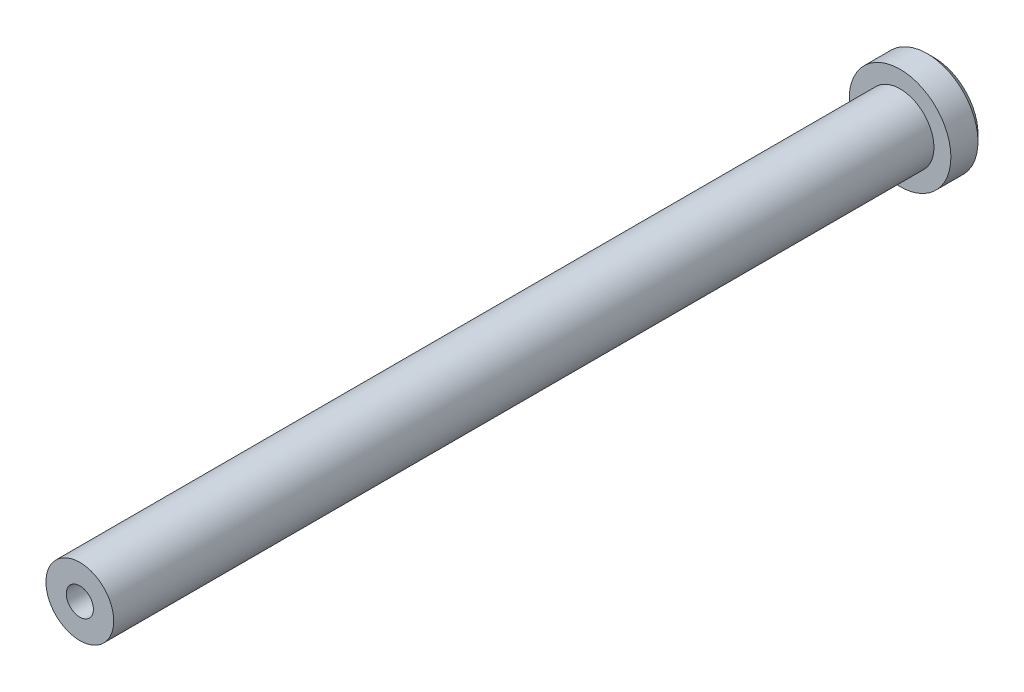
ISO-10303-21;
HEADER;
FILE_DESCRIPTION(('STEP AP214'),'2;1');
FILE_NAME('part.step','',(''),(''),'','','');
FILE_SCHEMA(('AUTOMOTIVE_DESIGN { 1 0 10303 214 1 1 1 1 }'));
ENDSEC;
DATA;
#1=APPLICATION_CONTEXT('core data for automotive mechanical design processes');
#2=APPLICATION_PROTOCOL_DEFINITION('international standard','automotive_design',2000,#1);
#3=PRODUCT_CONTEXT('',#1,'mechanical');
#4=PRODUCT('Part','Part','',(#3));
#5=PRODUCT_RELATED_PRODUCT_CATEGORY('part','',(#4));
#6=PRODUCT_DEFINITION_FORMATION('','',#4);
#7=PRODUCT_DEFINITION_CONTEXT('part definition',#1,'design');
#8=PRODUCT_DEFINITION('design','',#6,#7);
#9=PRODUCT_DEFINITION_SHAPE('','',#8);
#10=(LENGTH_UNIT() NAMED_UNIT(*) SI_UNIT(.MILLI.,.METRE.));
#11=(NAMED_UNIT(*) PLANE_ANGLE_UNIT() SI_UNIT($,.RADIAN.));
#12=(NAMED_UNIT(*) SI_UNIT($,.STERADIAN.) SOLID_ANGLE_UNIT());
#13=UNCERTAINTY_MEASURE_WITH_UNIT(LENGTH_MEASURE(1.E-05),#10,'distance_accuracy_value','');
#14=(GEOMETRIC_REPRESENTATION_CONTEXT(3) GLOBAL_UNCERTAINTY_ASSIGNED_CONTEXT((#13)) GLOBAL_UNIT_ASSIGNED_CONTEXT((#10,
#11,#12)) REPRESENTATION_CONTEXT('',''));
#15=CARTESIAN_POINT('',(0.,0.,0.));
#16=DIRECTION('',(0.,0.,1.));
#17=DIRECTION('',(1.,0.,0.));
#18=AXIS2_PLACEMENT_3D('',#15,#16,#17);
#19=CARTESIAN_POINT('',(0.,0.,5.));
#20=DIRECTION('',(0.,0.,-1.));
#21=DIRECTION('',(-1.,0.,0.));
#22=AXIS2_PLACEMENT_3D('',#19,#20,#21);
#23=CYLINDRICAL_SURFACE('',#22,7.5);
#24=CARTESIAN_POINT('',(0.,0.,0.999999999999995));
#25=DIRECTION('',(0.,0.,1.));
#26=DIRECTION('',(1.,0.,0.));
#27=AXIS2_PLACEMENT_3D('',#24,#25,#26);
#28=CIRCLE('',#27,7.5);
#29=CARTESIAN_POINT('',(7.5,0.,0.999999999999995));
#30=VERTEX_POINT('',#29);
#31=EDGE_CURVE('E47',#30,#30,#28,.T.);
#32=ORIENTED_EDGE('',*,*,#31,.T.);
#33=EDGE_LOOP('',(#32));
#34=FACE_BOUND('',#33,.T.);
#35=CARTESIAN_POINT('',(0.,0.,5.));
#36=DIRECTION('',(0.,0.,1.));
#37=DIRECTION('',(1.,0.,0.));
#38=AXIS2_PLACEMENT_3D('',#35,#36,#37);
#39=CIRCLE('',#38,7.5);
#40=CARTESIAN_POINT('',(7.5,0.,5.));
#41=VERTEX_POINT('',#40);
#42=EDGE_CURVE('E53',#41,#41,#39,.T.);
#43=ORIENTED_EDGE('',*,*,#42,.F.);
#44=EDGE_LOOP('',(#43));
#45=FACE_BOUND('',#44,.T.);
#46=ADVANCED_FACE('F39',(#34,#45),#23,.T.);
#47=CARTESIAN_POINT('',(0.,0.,5.));
#48=DIRECTION('',(0.,0.,1.));
#49=DIRECTION('',(1.,0.,0.));
#50=AXIS2_PLACEMENT_3D('',#47,#48,#49);
#51=PLANE('',#50);
#52=CARTESIAN_POINT('',(0.,0.,5.));
#53=DIRECTION('',(0.,0.,1.));
#54=DIRECTION('',(1.,0.,0.));
#55=AXIS2_PLACEMENT_3D('',#52,#53,#54);
#56=CIRCLE('',#55,5.);
#57=CARTESIAN_POINT('',(5.,0.,5.));
#58=VERTEX_POINT('',#57);
#59=EDGE_CURVE('E62',#58,#58,#56,.T.);
#60=ORIENTED_EDGE('',*,*,#59,.F.);
#61=EDGE_LOOP('',(#60));
#62=FACE_BOUND('',#61,.T.);
#63=ORIENTED_EDGE('',*,*,#42,.T.);
#64=EDGE_LOOP('',(#63));
#65=FACE_BOUND('',#64,.T.);
#66=ADVANCED_FACE('F99',(#62,#65),#51,.T.);
#67=CARTESIAN_POINT('',(0.,0.,0.));
#68=DIRECTION('',(0.,0.,1.));
#69=DIRECTION('',(1.,0.,0.));
#70=AXIS2_PLACEMENT_3D('',#67,#68,#69);
#71=PLANE('',#70);
#72=CARTESIAN_POINT('',(0.,0.,0.));
#73=DIRECTION('',(0.,0.,1.));
#74=DIRECTION('',(1.,0.,0.));
#75=AXIS2_PLACEMENT_3D('',#72,#73,#74);
#76=CIRCLE('',#75,6.5);
#77=CARTESIAN_POINT('',(6.5,0.,0.));
#78=VERTEX_POINT('',#77);
#79=EDGE_CURVE('E10',#78,#78,#76,.F.);
#80=ORIENTED_EDGE('',*,*,#79,.T.);
#81=EDGE_LOOP('',(#80));
#82=FACE_BOUND('',#81,.T.);
#83=ADVANCED_FACE('F102',(#82),#71,.F.);
#84=CARTESIAN_POINT('',(0.,0.,0.999999999999995));
#85=DIRECTION('',(0.,0.,1.));
#86=DIRECTION('',(1.,0.,0.));
#87=AXIS2_PLACEMENT_3D('',#84,#85,#86);
#88=CONICAL_SURFACE('',#87,7.5,0.78539816339745);
#89=ORIENTED_EDGE('',*,*,#79,.F.);
#90=EDGE_LOOP('',(#89));
#91=FACE_BOUND('',#90,.T.);
#92=ORIENTED_EDGE('',*,*,#31,.F.);
#93=EDGE_LOOP('',(#92));
#94=FACE_BOUND('',#93,.T.);
#95=ADVANCED_FACE('F41',(#91,#94),#88,.T.);
#96=CARTESIAN_POINT('',(0.,0.,126.));
#97=DIRECTION('',(0.,0.,-1.));
#98=DIRECTION('',(-1.,0.,0.));
#99=AXIS2_PLACEMENT_3D('',#96,#97,#98);
#100=CYLINDRICAL_SURFACE('',#99,5.);
#101=CARTESIAN_POINT('',(0.,0.,126.));
#102=DIRECTION('',(0.,0.,1.));
#103=DIRECTION('',(1.,0.,0.));
#104=AXIS2_PLACEMENT_3D('',#101,#102,#103);
#105=CIRCLE('',#104,5.);
#106=CARTESIAN_POINT('',(5.,0.,126.));
#107=VERTEX_POINT('',#106);
#108=EDGE_CURVE('E59',#107,#107,#105,.T.);
#109=ORIENTED_EDGE('',*,*,#108,.F.);
#110=EDGE_LOOP('',(#109));
#111=FACE_BOUND('',#110,.T.);
#112=ORIENTED_EDGE('',*,*,#59,.T.);
#113=EDGE_LOOP('',(#112));
#114=FACE_BOUND('',#113,.T.);
#115=ADVANCED_FACE('F90',(#111,#114),#100,.T.);
#116=CARTESIAN_POINT('',(0.,0.,126.));
#117=DIRECTION('',(0.,0.,1.));
#118=DIRECTION('',(1.,0.,0.));
#119=AXIS2_PLACEMENT_3D('',#116,#117,#118);
#120=PLANE('',#119);
#121=CARTESIAN_POINT('',(0.,0.,126.));
#122=DIRECTION('',(0.,0.,1.));
#123=DIRECTION('',(1.,0.,0.));
#124=AXIS2_PLACEMENT_3D('',#121,#122,#123);
#125=CIRCLE('',#124,2.);
#126=CARTESIAN_POINT('',(2.,0.,126.));
#127=VERTEX_POINT('',#126);
#128=EDGE_CURVE('E70',#127,#127,#125,.T.);
#129=ORIENTED_EDGE('',*,*,#128,.F.);
#130=EDGE_LOOP('',(#129));
#131=FACE_BOUND('',#130,.T.);
#132=ORIENTED_EDGE('',*,*,#108,.T.);
#133=EDGE_LOOP('',(#132));
#134=FACE_BOUND('',#133,.T.);
#135=ADVANCED_FACE('F84',(#131,#134),#120,.T.);
#136=CARTESIAN_POINT('',(0.,0.,116.));
#137=DIRECTION('',(0.,0.,1.));
#138=DIRECTION('',(1.,0.,0.));
#139=AXIS2_PLACEMENT_3D('',#136,#137,#138);
#140=CYLINDRICAL_SURFACE('',#139,2.);
#141=CARTESIAN_POINT('',(0.,0.,116.));
#142=DIRECTION('',(0.,0.,1.));
#143=DIRECTION('',(1.,0.,0.));
#144=AXIS2_PLACEMENT_3D('',#141,#142,#143);
#145=CIRCLE('',#144,2.);
#146=CARTESIAN_POINT('',(2.,0.,116.));
#147=VERTEX_POINT('',#146);
#148=EDGE_CURVE('E66',#147,#147,#145,.T.);
#149=ORIENTED_EDGE('',*,*,#148,.F.);
#150=EDGE_LOOP('',(#149));
#151=FACE_BOUND('',#150,.T.);
#152=ORIENTED_EDGE('',*,*,#128,.T.);
#153=EDGE_LOOP('',(#152));
#154=FACE_BOUND('',#153,.T.);
#155=ADVANCED_FACE('F81',(#151,#154),#140,.F.);
#156=CARTESIAN_POINT('',(0.,0.,116.));
#157=DIRECTION('',(0.,0.,1.));
#158=DIRECTION('',(1.,0.,0.));
#159=AXIS2_PLACEMENT_3D('',#156,#157,#158);
#160=PLANE('',#159);
#161=ORIENTED_EDGE('',*,*,#148,.T.);
#162=EDGE_LOOP('',(#161));
#163=FACE_BOUND('',#162,.T.);
#164=ADVANCED_FACE('F79',(#163),#160,.T.);
#165=CLOSED_SHELL('',(#46,#66,#83,#95,#115,#135,#155,#164));
#166=MANIFOLD_SOLID_BREP('B2',#165);
#167=ADVANCED_BREP_SHAPE_REPRESENTATION('',(#18,#166),#14);
#168=SHAPE_DEFINITION_REPRESENTATION(#9,#167);
ENDSEC;
END-ISO-10303-21;
